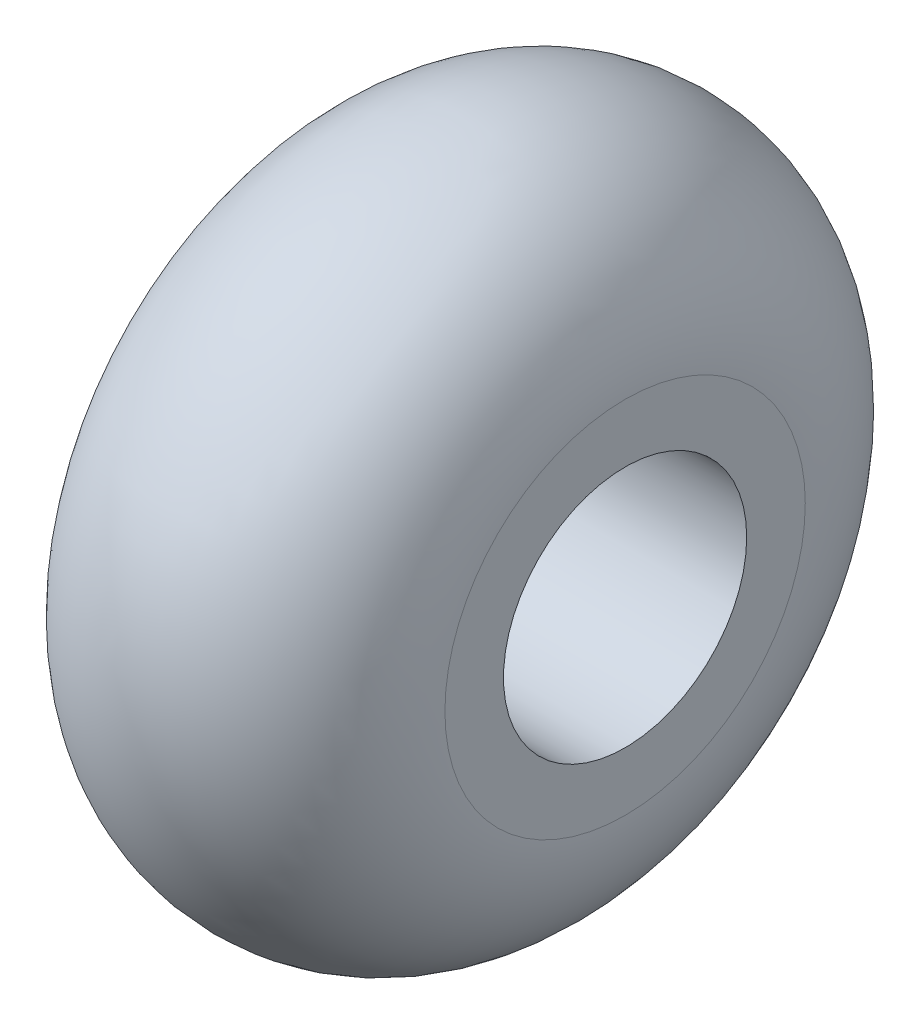
ISO-10303-21;
HEADER;
FILE_DESCRIPTION(('STEP AP214'),'2;1');
FILE_NAME('part.step','',(''),(''),'','','');
FILE_SCHEMA(('AUTOMOTIVE_DESIGN { 1 0 10303 214 1 1 1 1 }'));
ENDSEC;
DATA;
#1=APPLICATION_CONTEXT('core data for automotive mechanical design processes');
#2=APPLICATION_PROTOCOL_DEFINITION('international standard','automotive_design',2000,#1);
#3=PRODUCT_CONTEXT('',#1,'mechanical');
#4=PRODUCT('Part','Part','',(#3));
#5=PRODUCT_RELATED_PRODUCT_CATEGORY('part','',(#4));
#6=PRODUCT_DEFINITION_FORMATION('','',#4);
#7=PRODUCT_DEFINITION_CONTEXT('part definition',#1,'design');
#8=PRODUCT_DEFINITION('design','',#6,#7);
#9=PRODUCT_DEFINITION_SHAPE('','',#8);
#10=(LENGTH_UNIT() NAMED_UNIT(*) SI_UNIT(.MILLI.,.METRE.));
#11=(NAMED_UNIT(*) PLANE_ANGLE_UNIT() SI_UNIT($,.RADIAN.));
#12=(NAMED_UNIT(*) SI_UNIT($,.STERADIAN.) SOLID_ANGLE_UNIT());
#13=UNCERTAINTY_MEASURE_WITH_UNIT(LENGTH_MEASURE(1.E-05),#10,'distance_accuracy_value','');
#14=(GEOMETRIC_REPRESENTATION_CONTEXT(3) GLOBAL_UNCERTAINTY_ASSIGNED_CONTEXT((#13)) GLOBAL_UNIT_ASSIGNED_CONTEXT((#10,
#11,#12)) REPRESENTATION_CONTEXT('',''));
#15=CARTESIAN_POINT('',(0.,0.,0.));
#16=DIRECTION('',(0.,0.,1.));
#17=DIRECTION('',(1.,0.,0.));
#18=AXIS2_PLACEMENT_3D('',#15,#16,#17);
#19=CARTESIAN_POINT('',(11.,6.,0.));
#20=DIRECTION('',(1.,0.,0.));
#21=DIRECTION('',(0.,0.,-1.));
#22=AXIS2_PLACEMENT_3D('',#19,#20,#21);
#23=PLANE('',#22);
#24=CARTESIAN_POINT('',(11.,0.,0.));
#25=DIRECTION('',(1.,0.,0.));
#26=DIRECTION('',(0.,0.,-1.));
#27=AXIS2_PLACEMENT_3D('',#24,#25,#26);
#28=CIRCLE('',#27,6.);
#29=CARTESIAN_POINT('',(11.,0.,-6.));
#30=VERTEX_POINT('',#29);
#31=EDGE_CURVE('E47',#30,#30,#28,.T.);
#32=ORIENTED_EDGE('',*,*,#31,.T.);
#33=EDGE_LOOP('',(#32));
#34=FACE_BOUND('',#33,.T.);
#35=CARTESIAN_POINT('',(11.,0.,0.));
#36=DIRECTION('',(1.,0.,0.));
#37=DIRECTION('',(0.,0.,-1.));
#38=AXIS2_PLACEMENT_3D('',#35,#36,#37);
#39=CIRCLE('',#38,4.05);
#40=CARTESIAN_POINT('',(11.,0.,-4.05));
#41=VERTEX_POINT('',#40);
#42=EDGE_CURVE('E10',#41,#41,#39,.T.);
#43=ORIENTED_EDGE('',*,*,#42,.F.);
#44=EDGE_LOOP('',(#43));
#45=FACE_BOUND('',#44,.T.);
#46=ADVANCED_FACE('F33',(#34,#45),#23,.T.);
#47=CARTESIAN_POINT('',(13.6093117408907,0.,0.));
#48=DIRECTION('',(1.,0.,0.));
#49=DIRECTION('',(0.,0.,-1.));
#50=AXIS2_PLACEMENT_3D('',#47,#48,#49);
#51=CYLINDRICAL_SURFACE('',#50,4.05);
#52=ORIENTED_EDGE('',*,*,#42,.T.);
#53=EDGE_LOOP('',(#52));
#54=FACE_BOUND('',#53,.T.);
#55=CARTESIAN_POINT('',(0.,0.,0.));
#56=DIRECTION('',(1.,0.,0.));
#57=DIRECTION('',(0.,0.,-1.));
#58=AXIS2_PLACEMENT_3D('',#55,#56,#57);
#59=CIRCLE('',#58,4.05);
#60=CARTESIAN_POINT('',(0.,0.,-4.05));
#61=VERTEX_POINT('',#60);
#62=EDGE_CURVE('E39',#61,#61,#59,.T.);
#63=ORIENTED_EDGE('',*,*,#62,.F.);
#64=EDGE_LOOP('',(#63));
#65=FACE_BOUND('',#64,.T.);
#66=ADVANCED_FACE('F63',(#54,#65),#51,.F.);
#67=CARTESIAN_POINT('',(0.,4.05,0.));
#68=DIRECTION('',(-1.,0.,0.));
#69=DIRECTION('',(0.,0.,1.));
#70=AXIS2_PLACEMENT_3D('',#67,#68,#69);
#71=PLANE('',#70);
#72=ORIENTED_EDGE('',*,*,#62,.T.);
#73=EDGE_LOOP('',(#72));
#74=FACE_BOUND('',#73,.T.);
#75=CARTESIAN_POINT('',(0.,0.,0.));
#76=DIRECTION('',(1.,0.,0.));
#77=DIRECTION('',(0.,0.,-1.));
#78=AXIS2_PLACEMENT_3D('',#75,#76,#77);
#79=CIRCLE('',#78,6.);
#80=CARTESIAN_POINT('',(0.,0.,-6.));
#81=VERTEX_POINT('',#80);
#82=EDGE_CURVE('E43',#81,#81,#79,.T.);
#83=ORIENTED_EDGE('',*,*,#82,.F.);
#84=EDGE_LOOP('',(#83));
#85=FACE_BOUND('',#84,.T.);
#86=ADVANCED_FACE('F57',(#74,#85),#71,.T.);
#87=CARTESIAN_POINT('',(5.5,0.,0.));
#88=DIRECTION('',(1.,0.,0.));
#89=DIRECTION('',(0.,0.,-1.));
#90=AXIS2_PLACEMENT_3D('',#87,#88,#89);
#91=TOROIDAL_SURFACE('',#90,6.,5.5);
#92=ORIENTED_EDGE('',*,*,#82,.T.);
#93=EDGE_LOOP('',(#92));
#94=FACE_BOUND('',#93,.T.);
#95=ORIENTED_EDGE('',*,*,#31,.F.);
#96=EDGE_LOOP('',(#95));
#97=FACE_BOUND('',#96,.T.);
#98=ADVANCED_FACE('F55',(#94,#97),#91,.T.);
#99=CLOSED_SHELL('',(#46,#66,#86,#98));
#100=MANIFOLD_SOLID_BREP('B2',#99);
#101=ADVANCED_BREP_SHAPE_REPRESENTATION('',(#18,#100),#14);
#102=SHAPE_DEFINITION_REPRESENTATION(#9,#101);
ENDSEC;
END-ISO-10303-21;
